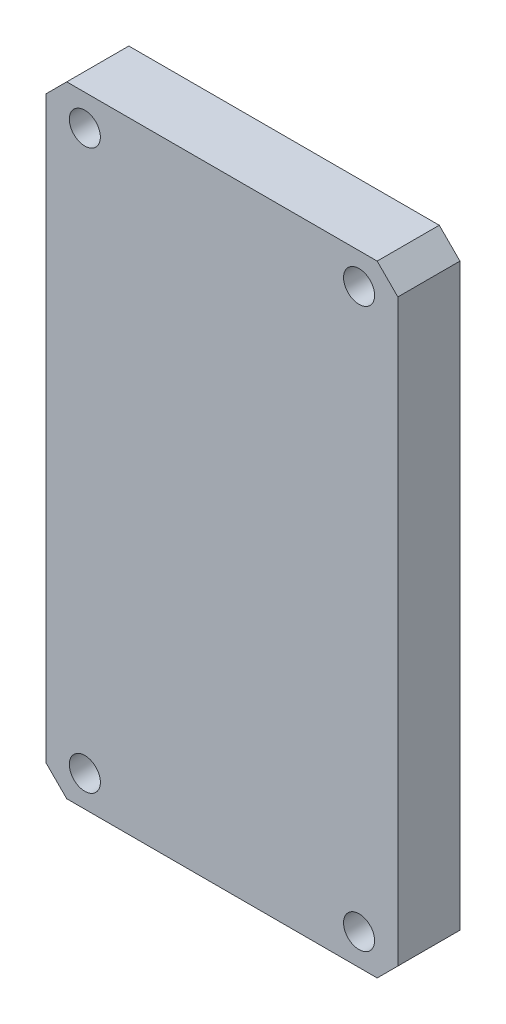
ISO-10303-21;
HEADER;
FILE_DESCRIPTION(('STEP AP214'),'2;1');
FILE_NAME('part.step','',(''),(''),'','','');
FILE_SCHEMA(('AUTOMOTIVE_DESIGN { 1 0 10303 214 1 1 1 1 }'));
ENDSEC;
DATA;
#1=APPLICATION_CONTEXT('core data for automotive mechanical design processes');
#2=APPLICATION_PROTOCOL_DEFINITION('international standard','automotive_design',2000,#1);
#3=PRODUCT_CONTEXT('',#1,'mechanical');
#4=PRODUCT('Part','Part','',(#3));
#5=PRODUCT_RELATED_PRODUCT_CATEGORY('part','',(#4));
#6=PRODUCT_DEFINITION_FORMATION('','',#4);
#7=PRODUCT_DEFINITION_CONTEXT('part definition',#1,'design');
#8=PRODUCT_DEFINITION('design','',#6,#7);
#9=PRODUCT_DEFINITION_SHAPE('','',#8);
#10=(LENGTH_UNIT() NAMED_UNIT(*) SI_UNIT(.MILLI.,.METRE.));
#11=(NAMED_UNIT(*) PLANE_ANGLE_UNIT() SI_UNIT($,.RADIAN.));
#12=(NAMED_UNIT(*) SI_UNIT($,.STERADIAN.) SOLID_ANGLE_UNIT());
#13=UNCERTAINTY_MEASURE_WITH_UNIT(LENGTH_MEASURE(1.E-05),#10,'distance_accuracy_value','');
#14=(GEOMETRIC_REPRESENTATION_CONTEXT(3) GLOBAL_UNCERTAINTY_ASSIGNED_CONTEXT((#13)) GLOBAL_UNIT_ASSIGNED_CONTEXT((#10,
#11,#12)) REPRESENTATION_CONTEXT('',''));
#15=CARTESIAN_POINT('',(0.,0.,0.));
#16=DIRECTION('',(0.,0.,1.));
#17=DIRECTION('',(1.,0.,0.));
#18=AXIS2_PLACEMENT_3D('',#15,#16,#17);
#19=CARTESIAN_POINT('',(0.,0.,6.));
#20=DIRECTION('',(1.,0.,0.));
#21=DIRECTION('',(0.,0.,-1.));
#22=AXIS2_PLACEMENT_3D('',#19,#20,#21);
#23=PLANE('',#22);
#24=DIRECTION('',(0.,-1.,0.));
#25=VECTOR('',#24,1.);
#26=CARTESIAN_POINT('',(0.,0.,0.));
#27=LINE('',#26,#25);
#28=CARTESIAN_POINT('',(0.,58.,0.));
#29=VERTEX_POINT('',#28);
#30=CARTESIAN_POINT('',(0.,2.,0.));
#31=VERTEX_POINT('',#30);
#32=EDGE_CURVE('E149',#29,#31,#27,.T.);
#33=ORIENTED_EDGE('',*,*,#32,.T.);
#34=DIRECTION('',(0.,0.,1.));
#35=VECTOR('',#34,1.);
#36=CARTESIAN_POINT('',(0.,2.,6.));
#37=LINE('',#36,#35);
#38=CARTESIAN_POINT('',(0.,2.,6.));
#39=VERTEX_POINT('',#38);
#40=EDGE_CURVE('E181',#31,#39,#37,.T.);
#41=ORIENTED_EDGE('',*,*,#40,.T.);
#42=DIRECTION('',(0.,-1.,0.));
#43=VECTOR('',#42,1.);
#44=CARTESIAN_POINT('',(0.,0.,6.));
#45=LINE('',#44,#43);
#46=CARTESIAN_POINT('',(0.,58.,6.));
#47=VERTEX_POINT('',#46);
#48=EDGE_CURVE('E150',#47,#39,#45,.T.);
#49=ORIENTED_EDGE('',*,*,#48,.F.);
#50=DIRECTION('',(0.,0.,-1.));
#51=VECTOR('',#50,1.);
#52=CARTESIAN_POINT('',(0.,58.,6.));
#53=LINE('',#52,#51);
#54=EDGE_CURVE('E179',#47,#29,#53,.T.);
#55=ORIENTED_EDGE('',*,*,#54,.T.);
#56=EDGE_LOOP('',(#33,#41,#49,#55));
#57=FACE_BOUND('',#56,.T.);
#58=ADVANCED_FACE('F50',(#57),#23,.F.);
#59=CARTESIAN_POINT('',(0.,0.,6.));
#60=DIRECTION('',(0.,1.,0.));
#61=DIRECTION('',(0.,0.,1.));
#62=AXIS2_PLACEMENT_3D('',#59,#60,#61);
#63=PLANE('',#62);
#64=DIRECTION('',(1.,0.,0.));
#65=VECTOR('',#64,1.);
#66=CARTESIAN_POINT('',(0.,0.,0.));
#67=LINE('',#66,#65);
#68=CARTESIAN_POINT('',(2.,0.,0.));
#69=VERTEX_POINT('',#68);
#70=CARTESIAN_POINT('',(32.,0.,0.));
#71=VERTEX_POINT('',#70);
#72=EDGE_CURVE('E141',#69,#71,#67,.T.);
#73=ORIENTED_EDGE('',*,*,#72,.T.);
#74=DIRECTION('',(0.,0.,1.));
#75=VECTOR('',#74,1.);
#76=CARTESIAN_POINT('',(32.,0.,6.));
#77=LINE('',#76,#75);
#78=CARTESIAN_POINT('',(32.,0.,6.));
#79=VERTEX_POINT('',#78);
#80=EDGE_CURVE('E118',#71,#79,#77,.T.);
#81=ORIENTED_EDGE('',*,*,#80,.T.);
#82=DIRECTION('',(1.,0.,0.));
#83=VECTOR('',#82,1.);
#84=CARTESIAN_POINT('',(0.,0.,6.));
#85=LINE('',#84,#83);
#86=CARTESIAN_POINT('',(2.,0.,6.));
#87=VERTEX_POINT('',#86);
#88=EDGE_CURVE('E205',#87,#79,#85,.T.);
#89=ORIENTED_EDGE('',*,*,#88,.F.);
#90=DIRECTION('',(0.,0.,-1.));
#91=VECTOR('',#90,1.);
#92=CARTESIAN_POINT('',(2.,0.,6.));
#93=LINE('',#92,#91);
#94=EDGE_CURVE('E121',#87,#69,#93,.T.);
#95=ORIENTED_EDGE('',*,*,#94,.T.);
#96=EDGE_LOOP('',(#73,#81,#89,#95));
#97=FACE_BOUND('',#96,.T.);
#98=ADVANCED_FACE('F259',(#97),#63,.F.);
#99=CARTESIAN_POINT('',(34.,0.,6.));
#100=DIRECTION('',(-1.,0.,0.));
#101=DIRECTION('',(0.,0.,1.));
#102=AXIS2_PLACEMENT_3D('',#99,#100,#101);
#103=PLANE('',#102);
#104=DIRECTION('',(0.,1.,0.));
#105=VECTOR('',#104,1.);
#106=CARTESIAN_POINT('',(34.,0.,6.));
#107=LINE('',#106,#105);
#108=CARTESIAN_POINT('',(34.,2.,6.));
#109=VERTEX_POINT('',#108);
#110=CARTESIAN_POINT('',(34.,58.,6.));
#111=VERTEX_POINT('',#110);
#112=EDGE_CURVE('E133',#109,#111,#107,.T.);
#113=ORIENTED_EDGE('',*,*,#112,.F.);
#114=DIRECTION('',(0.,0.,-1.));
#115=VECTOR('',#114,1.);
#116=CARTESIAN_POINT('',(34.,2.,6.));
#117=LINE('',#116,#115);
#118=CARTESIAN_POINT('',(34.,2.,0.));
#119=VERTEX_POINT('',#118);
#120=EDGE_CURVE('E117',#109,#119,#117,.T.);
#121=ORIENTED_EDGE('',*,*,#120,.T.);
#122=DIRECTION('',(0.,1.,0.));
#123=VECTOR('',#122,1.);
#124=CARTESIAN_POINT('',(34.,0.,0.));
#125=LINE('',#124,#123);
#126=CARTESIAN_POINT('',(34.,58.,0.));
#127=VERTEX_POINT('',#126);
#128=EDGE_CURVE('E135',#119,#127,#125,.T.);
#129=ORIENTED_EDGE('',*,*,#128,.T.);
#130=DIRECTION('',(0.,0.,1.));
#131=VECTOR('',#130,1.);
#132=CARTESIAN_POINT('',(34.,58.,6.));
#133=LINE('',#132,#131);
#134=EDGE_CURVE('E140',#127,#111,#133,.T.);
#135=ORIENTED_EDGE('',*,*,#134,.T.);
#136=EDGE_LOOP('',(#113,#121,#129,#135));
#137=FACE_BOUND('',#136,.T.);
#138=ADVANCED_FACE('F131',(#137),#103,.F.);
#139=CARTESIAN_POINT('',(0.,60.,6.));
#140=DIRECTION('',(0.,-1.,0.));
#141=DIRECTION('',(0.,0.,-1.));
#142=AXIS2_PLACEMENT_3D('',#139,#140,#141);
#143=PLANE('',#142);
#144=DIRECTION('',(-1.,0.,0.));
#145=VECTOR('',#144,1.);
#146=CARTESIAN_POINT('',(0.,60.,0.));
#147=LINE('',#146,#145);
#148=CARTESIAN_POINT('',(32.,60.,0.));
#149=VERTEX_POINT('',#148);
#150=CARTESIAN_POINT('',(2.,60.,0.));
#151=VERTEX_POINT('',#150);
#152=EDGE_CURVE('E142',#149,#151,#147,.T.);
#153=ORIENTED_EDGE('',*,*,#152,.T.);
#154=DIRECTION('',(0.,0.,1.));
#155=VECTOR('',#154,1.);
#156=CARTESIAN_POINT('',(2.,60.,6.));
#157=LINE('',#156,#155);
#158=CARTESIAN_POINT('',(2.,60.,6.));
#159=VERTEX_POINT('',#158);
#160=EDGE_CURVE('E11',#151,#159,#157,.T.);
#161=ORIENTED_EDGE('',*,*,#160,.T.);
#162=DIRECTION('',(-1.,0.,0.));
#163=VECTOR('',#162,1.);
#164=CARTESIAN_POINT('',(0.,60.,6.));
#165=LINE('',#164,#163);
#166=CARTESIAN_POINT('',(32.,60.,6.));
#167=VERTEX_POINT('',#166);
#168=EDGE_CURVE('E152',#167,#159,#165,.T.);
#169=ORIENTED_EDGE('',*,*,#168,.F.);
#170=DIRECTION('',(0.,0.,-1.));
#171=VECTOR('',#170,1.);
#172=CARTESIAN_POINT('',(32.,60.,6.));
#173=LINE('',#172,#171);
#174=EDGE_CURVE('E60',#167,#149,#173,.T.);
#175=ORIENTED_EDGE('',*,*,#174,.T.);
#176=EDGE_LOOP('',(#153,#161,#169,#175));
#177=FACE_BOUND('',#176,.T.);
#178=ADVANCED_FACE('F187',(#177),#143,.F.);
#179=CARTESIAN_POINT('',(0.,0.,6.));
#180=DIRECTION('',(0.,0.,-1.));
#181=DIRECTION('',(-1.,0.,0.));
#182=AXIS2_PLACEMENT_3D('',#179,#180,#181);
#183=PLANE('',#182);
#184=CARTESIAN_POINT('',(30.25,57.,6.));
#185=DIRECTION('',(0.,0.,1.));
#186=DIRECTION('',(1.,0.,0.));
#187=AXIS2_PLACEMENT_3D('',#184,#185,#186);
#188=CIRCLE('',#187,1.5);
#189=CARTESIAN_POINT('',(31.75,57.,6.));
#190=VERTEX_POINT('',#189);
#191=EDGE_CURVE('E225',#190,#190,#188,.T.);
#192=ORIENTED_EDGE('',*,*,#191,.F.);
#193=EDGE_LOOP('',(#192));
#194=FACE_BOUND('',#193,.T.);
#195=CARTESIAN_POINT('',(3.75000000000001,3.,6.));
#196=DIRECTION('',(0.,0.,1.));
#197=DIRECTION('',(1.,0.,0.));
#198=AXIS2_PLACEMENT_3D('',#195,#196,#197);
#199=CIRCLE('',#198,1.5);
#200=CARTESIAN_POINT('',(5.25000000000001,3.,6.));
#201=VERTEX_POINT('',#200);
#202=EDGE_CURVE('E227',#201,#201,#199,.T.);
#203=ORIENTED_EDGE('',*,*,#202,.F.);
#204=EDGE_LOOP('',(#203));
#205=FACE_BOUND('',#204,.T.);
#206=CARTESIAN_POINT('',(30.25,3.,6.));
#207=DIRECTION('',(0.,0.,1.));
#208=DIRECTION('',(1.,0.,0.));
#209=AXIS2_PLACEMENT_3D('',#206,#207,#208);
#210=CIRCLE('',#209,1.5);
#211=CARTESIAN_POINT('',(31.75,3.,6.));
#212=VERTEX_POINT('',#211);
#213=EDGE_CURVE('E228',#212,#212,#210,.T.);
#214=ORIENTED_EDGE('',*,*,#213,.F.);
#215=EDGE_LOOP('',(#214));
#216=FACE_BOUND('',#215,.T.);
#217=CARTESIAN_POINT('',(3.75,57.,6.));
#218=DIRECTION('',(0.,0.,1.));
#219=DIRECTION('',(1.,0.,0.));
#220=AXIS2_PLACEMENT_3D('',#217,#218,#219);
#221=CIRCLE('',#220,1.5);
#222=CARTESIAN_POINT('',(5.25,57.,6.));
#223=VERTEX_POINT('',#222);
#224=EDGE_CURVE('E208',#223,#223,#221,.T.);
#225=ORIENTED_EDGE('',*,*,#224,.F.);
#226=EDGE_LOOP('',(#225));
#227=FACE_BOUND('',#226,.T.);
#228=ORIENTED_EDGE('',*,*,#88,.T.);
#229=DIRECTION('',(-0.707106781186548,-0.707106781186548,0.));
#230=VECTOR('',#229,1.);
#231=CARTESIAN_POINT('',(34.,2.,6.));
#232=LINE('',#231,#230);
#233=EDGE_CURVE('E177',#79,#109,#232,.F.);
#234=ORIENTED_EDGE('',*,*,#233,.T.);
#235=ORIENTED_EDGE('',*,*,#112,.T.);
#236=DIRECTION('',(0.707106781186548,-0.707106781186548,0.));
#237=VECTOR('',#236,1.);
#238=CARTESIAN_POINT('',(32.,60.,6.));
#239=LINE('',#238,#237);
#240=EDGE_CURVE('E69',#111,#167,#239,.F.);
#241=ORIENTED_EDGE('',*,*,#240,.T.);
#242=ORIENTED_EDGE('',*,*,#168,.T.);
#243=DIRECTION('',(0.707106781186548,0.707106781186548,0.));
#244=VECTOR('',#243,1.);
#245=CARTESIAN_POINT('',(0.,58.,6.));
#246=LINE('',#245,#244);
#247=EDGE_CURVE('E168',#159,#47,#246,.F.);
#248=ORIENTED_EDGE('',*,*,#247,.T.);
#249=ORIENTED_EDGE('',*,*,#48,.T.);
#250=DIRECTION('',(-0.707106781186548,0.707106781186548,0.));
#251=VECTOR('',#250,1.);
#252=CARTESIAN_POINT('',(2.,0.,6.));
#253=LINE('',#252,#251);
#254=EDGE_CURVE('E172',#39,#87,#253,.F.);
#255=ORIENTED_EDGE('',*,*,#254,.T.);
#256=EDGE_LOOP('',(#228,#234,#235,#241,#242,#248,#249,#255));
#257=FACE_BOUND('',#256,.T.);
#258=ADVANCED_FACE('F246',(#194,#205,#216,#227,#257),#183,.F.);
#259=CARTESIAN_POINT('',(0.,0.,0.));
#260=DIRECTION('',(0.,0.,-1.));
#261=DIRECTION('',(-1.,0.,0.));
#262=AXIS2_PLACEMENT_3D('',#259,#260,#261);
#263=PLANE('',#262);
#264=CARTESIAN_POINT('',(30.25,57.,0.));
#265=DIRECTION('',(0.,0.,1.));
#266=DIRECTION('',(1.,0.,0.));
#267=AXIS2_PLACEMENT_3D('',#264,#265,#266);
#268=CIRCLE('',#267,1.5);
#269=CARTESIAN_POINT('',(31.75,57.,0.));
#270=VERTEX_POINT('',#269);
#271=EDGE_CURVE('E233',#270,#270,#268,.T.);
#272=ORIENTED_EDGE('',*,*,#271,.T.);
#273=EDGE_LOOP('',(#272));
#274=FACE_BOUND('',#273,.T.);
#275=CARTESIAN_POINT('',(3.75000000000001,3.,0.));
#276=DIRECTION('',(0.,0.,1.));
#277=DIRECTION('',(1.,0.,0.));
#278=AXIS2_PLACEMENT_3D('',#275,#276,#277);
#279=CIRCLE('',#278,1.5);
#280=CARTESIAN_POINT('',(5.25000000000001,3.,0.));
#281=VERTEX_POINT('',#280);
#282=EDGE_CURVE('E221',#281,#281,#279,.T.);
#283=ORIENTED_EDGE('',*,*,#282,.T.);
#284=EDGE_LOOP('',(#283));
#285=FACE_BOUND('',#284,.T.);
#286=CARTESIAN_POINT('',(30.25,3.,0.));
#287=DIRECTION('',(0.,0.,1.));
#288=DIRECTION('',(1.,0.,0.));
#289=AXIS2_PLACEMENT_3D('',#286,#287,#288);
#290=CIRCLE('',#289,1.5);
#291=CARTESIAN_POINT('',(31.75,3.,0.));
#292=VERTEX_POINT('',#291);
#293=EDGE_CURVE('E238',#292,#292,#290,.T.);
#294=ORIENTED_EDGE('',*,*,#293,.T.);
#295=EDGE_LOOP('',(#294));
#296=FACE_BOUND('',#295,.T.);
#297=CARTESIAN_POINT('',(3.75,57.,0.));
#298=DIRECTION('',(0.,0.,1.));
#299=DIRECTION('',(1.,0.,0.));
#300=AXIS2_PLACEMENT_3D('',#297,#298,#299);
#301=CIRCLE('',#300,1.5);
#302=CARTESIAN_POINT('',(5.25,57.,0.));
#303=VERTEX_POINT('',#302);
#304=EDGE_CURVE('E214',#303,#303,#301,.T.);
#305=ORIENTED_EDGE('',*,*,#304,.T.);
#306=EDGE_LOOP('',(#305));
#307=FACE_BOUND('',#306,.T.);
#308=ORIENTED_EDGE('',*,*,#128,.F.);
#309=DIRECTION('',(0.707106781186548,0.707106781186548,0.));
#310=VECTOR('',#309,1.);
#311=CARTESIAN_POINT('',(16.,-16.,0.));
#312=LINE('',#311,#310);
#313=EDGE_CURVE('E111',#119,#71,#312,.F.);
#314=ORIENTED_EDGE('',*,*,#313,.T.);
#315=ORIENTED_EDGE('',*,*,#72,.F.);
#316=DIRECTION('',(0.707106781186548,-0.707106781186548,0.));
#317=VECTOR('',#316,1.);
#318=CARTESIAN_POINT('',(1.,1.,0.));
#319=LINE('',#318,#317);
#320=EDGE_CURVE('E127',#69,#31,#319,.F.);
#321=ORIENTED_EDGE('',*,*,#320,.T.);
#322=ORIENTED_EDGE('',*,*,#32,.F.);
#323=DIRECTION('',(-0.707106781186548,-0.707106781186548,0.));
#324=VECTOR('',#323,1.);
#325=CARTESIAN_POINT('',(-29.,29.,0.));
#326=LINE('',#325,#324);
#327=EDGE_CURVE('E158',#29,#151,#326,.F.);
#328=ORIENTED_EDGE('',*,*,#327,.T.);
#329=ORIENTED_EDGE('',*,*,#152,.F.);
#330=DIRECTION('',(-0.707106781186548,0.707106781186548,0.));
#331=VECTOR('',#330,1.);
#332=CARTESIAN_POINT('',(46.,46.,0.));
#333=LINE('',#332,#331);
#334=EDGE_CURVE('E137',#149,#127,#333,.F.);
#335=ORIENTED_EDGE('',*,*,#334,.T.);
#336=EDGE_LOOP('',(#308,#314,#315,#321,#322,#328,#329,#335));
#337=FACE_BOUND('',#336,.T.);
#338=ADVANCED_FACE('F139',(#274,#285,#296,#307,#337),#263,.T.);
#339=CARTESIAN_POINT('',(3.75,57.,0.));
#340=DIRECTION('',(0.,0.,1.));
#341=DIRECTION('',(1.,0.,0.));
#342=AXIS2_PLACEMENT_3D('',#339,#340,#341);
#343=CYLINDRICAL_SURFACE('',#342,1.5);
#344=ORIENTED_EDGE('',*,*,#304,.F.);
#345=EDGE_LOOP('',(#344));
#346=FACE_BOUND('',#345,.T.);
#347=ORIENTED_EDGE('',*,*,#224,.T.);
#348=EDGE_LOOP('',(#347));
#349=FACE_BOUND('',#348,.T.);
#350=ADVANCED_FACE('F294',(#346,#349),#343,.F.);
#351=CARTESIAN_POINT('',(30.25,3.,0.));
#352=DIRECTION('',(0.,0.,1.));
#353=DIRECTION('',(1.,0.,0.));
#354=AXIS2_PLACEMENT_3D('',#351,#352,#353);
#355=CYLINDRICAL_SURFACE('',#354,1.5);
#356=ORIENTED_EDGE('',*,*,#293,.F.);
#357=EDGE_LOOP('',(#356));
#358=FACE_BOUND('',#357,.T.);
#359=ORIENTED_EDGE('',*,*,#213,.T.);
#360=EDGE_LOOP('',(#359));
#361=FACE_BOUND('',#360,.T.);
#362=ADVANCED_FACE('F248',(#358,#361),#355,.F.);
#363=CARTESIAN_POINT('',(3.75000000000001,3.,0.));
#364=DIRECTION('',(0.,0.,1.));
#365=DIRECTION('',(1.,0.,0.));
#366=AXIS2_PLACEMENT_3D('',#363,#364,#365);
#367=CYLINDRICAL_SURFACE('',#366,1.5);
#368=ORIENTED_EDGE('',*,*,#282,.F.);
#369=EDGE_LOOP('',(#368));
#370=FACE_BOUND('',#369,.T.);
#371=ORIENTED_EDGE('',*,*,#202,.T.);
#372=EDGE_LOOP('',(#371));
#373=FACE_BOUND('',#372,.T.);
#374=ADVANCED_FACE('F299',(#370,#373),#367,.F.);
#375=CARTESIAN_POINT('',(30.25,57.,0.));
#376=DIRECTION('',(0.,0.,1.));
#377=DIRECTION('',(1.,0.,0.));
#378=AXIS2_PLACEMENT_3D('',#375,#376,#377);
#379=CYLINDRICAL_SURFACE('',#378,1.5);
#380=ORIENTED_EDGE('',*,*,#271,.F.);
#381=EDGE_LOOP('',(#380));
#382=FACE_BOUND('',#381,.T.);
#383=ORIENTED_EDGE('',*,*,#191,.T.);
#384=EDGE_LOOP('',(#383));
#385=FACE_BOUND('',#384,.T.);
#386=ADVANCED_FACE('F268',(#382,#385),#379,.F.);
#387=CARTESIAN_POINT('',(34.,2.,6.));
#388=DIRECTION('',(-0.707106781186547,0.707106781186547,0.));
#389=DIRECTION('',(0.,0.,-1.));
#390=AXIS2_PLACEMENT_3D('',#387,#388,#389);
#391=PLANE('',#390);
#392=ORIENTED_EDGE('',*,*,#233,.F.);
#393=ORIENTED_EDGE('',*,*,#80,.F.);
#394=ORIENTED_EDGE('',*,*,#313,.F.);
#395=ORIENTED_EDGE('',*,*,#120,.F.);
#396=EDGE_LOOP('',(#392,#393,#394,#395));
#397=FACE_BOUND('',#396,.T.);
#398=ADVANCED_FACE('F120',(#397),#391,.F.);
#399=CARTESIAN_POINT('',(2.,0.,6.));
#400=DIRECTION('',(0.707106781186547,0.707106781186547,0.));
#401=DIRECTION('',(0.,0.,-1.));
#402=AXIS2_PLACEMENT_3D('',#399,#400,#401);
#403=PLANE('',#402);
#404=ORIENTED_EDGE('',*,*,#254,.F.);
#405=ORIENTED_EDGE('',*,*,#40,.F.);
#406=ORIENTED_EDGE('',*,*,#320,.F.);
#407=ORIENTED_EDGE('',*,*,#94,.F.);
#408=EDGE_LOOP('',(#404,#405,#406,#407));
#409=FACE_BOUND('',#408,.T.);
#410=ADVANCED_FACE('F261',(#409),#403,.F.);
#411=CARTESIAN_POINT('',(0.,58.,6.));
#412=DIRECTION('',(0.707106781186547,-0.707106781186547,0.));
#413=DIRECTION('',(0.,0.,-1.));
#414=AXIS2_PLACEMENT_3D('',#411,#412,#413);
#415=PLANE('',#414);
#416=ORIENTED_EDGE('',*,*,#247,.F.);
#417=ORIENTED_EDGE('',*,*,#160,.F.);
#418=ORIENTED_EDGE('',*,*,#327,.F.);
#419=ORIENTED_EDGE('',*,*,#54,.F.);
#420=EDGE_LOOP('',(#416,#417,#418,#419));
#421=FACE_BOUND('',#420,.T.);
#422=ADVANCED_FACE('F191',(#421),#415,.F.);
#423=CARTESIAN_POINT('',(32.,60.,6.));
#424=DIRECTION('',(-0.707106781186547,-0.707106781186547,0.));
#425=DIRECTION('',(0.,0.,-1.));
#426=AXIS2_PLACEMENT_3D('',#423,#424,#425);
#427=PLANE('',#426);
#428=ORIENTED_EDGE('',*,*,#240,.F.);
#429=ORIENTED_EDGE('',*,*,#134,.F.);
#430=ORIENTED_EDGE('',*,*,#334,.F.);
#431=ORIENTED_EDGE('',*,*,#174,.F.);
#432=EDGE_LOOP('',(#428,#429,#430,#431));
#433=FACE_BOUND('',#432,.T.);
#434=ADVANCED_FACE('F49',(#433),#427,.F.);
#435=CLOSED_SHELL('',(#58,#98,#138,#178,#258,#338,#350,#362,#374,#386,#398,#410,#422,#434));
#436=MANIFOLD_SOLID_BREP('B2',#435);
#437=ADVANCED_BREP_SHAPE_REPRESENTATION('',(#18,#436),#14);
#438=SHAPE_DEFINITION_REPRESENTATION(#9,#437);
ENDSEC;
END-ISO-10303-21;
